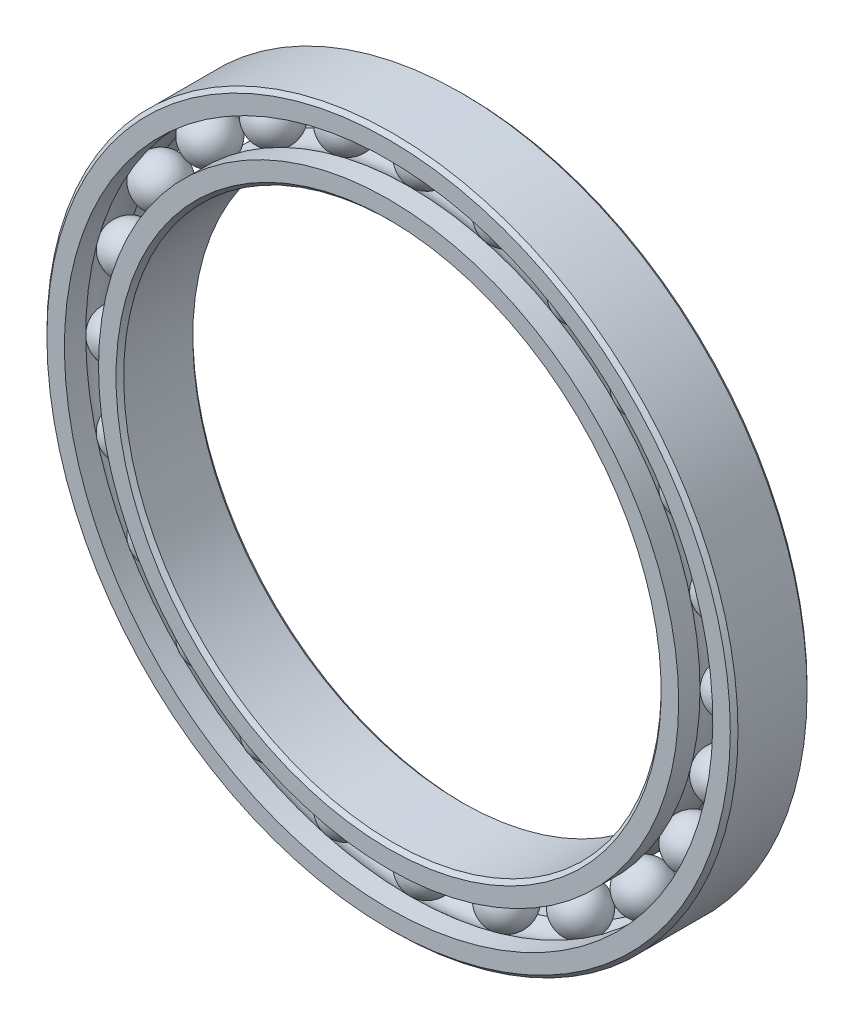
ISO-10303-21;
HEADER;
FILE_DESCRIPTION(('STEP AP214'),'2;1');
FILE_NAME('part.step','',(''),(''),'','','');
FILE_SCHEMA(('AUTOMOTIVE_DESIGN { 1 0 10303 214 1 1 1 1 }'));
ENDSEC;
DATA;
#1=APPLICATION_CONTEXT('core data for automotive mechanical design processes');
#2=APPLICATION_PROTOCOL_DEFINITION('international standard','automotive_design',2000,#1);
#3=PRODUCT_CONTEXT('',#1,'mechanical');
#4=PRODUCT('Part','Part','',(#3));
#5=PRODUCT_RELATED_PRODUCT_CATEGORY('part','',(#4));
#6=PRODUCT_DEFINITION_FORMATION('','',#4);
#7=PRODUCT_DEFINITION_CONTEXT('part definition',#1,'design');
#8=PRODUCT_DEFINITION('design','',#6,#7);
#9=PRODUCT_DEFINITION_SHAPE('','',#8);
#10=(LENGTH_UNIT() NAMED_UNIT(*) SI_UNIT(.MILLI.,.METRE.));
#11=(NAMED_UNIT(*) PLANE_ANGLE_UNIT() SI_UNIT($,.RADIAN.));
#12=(NAMED_UNIT(*) SI_UNIT($,.STERADIAN.) SOLID_ANGLE_UNIT());
#13=UNCERTAINTY_MEASURE_WITH_UNIT(LENGTH_MEASURE(1.E-05),#10,'distance_accuracy_value','');
#14=(GEOMETRIC_REPRESENTATION_CONTEXT(3) GLOBAL_UNCERTAINTY_ASSIGNED_CONTEXT((#13)) GLOBAL_UNIT_ASSIGNED_CONTEXT((#10,
#11,#12)) REPRESENTATION_CONTEXT('',''));
#15=CARTESIAN_POINT('',(0.,0.,0.));
#16=DIRECTION('',(0.,0.,1.));
#17=DIRECTION('',(1.,0.,0.));
#18=AXIS2_PLACEMENT_3D('',#15,#16,#17);
#19=CARTESIAN_POINT('',(10.3527618041003,38.6370330515629,0.));
#20=DIRECTION('',(0.,0.,1.));
#21=DIRECTION('',(0.258819045102508,0.965925826289072,0.));
#22=AXIS2_PLACEMENT_3D('',#19,#20,#21);
#23=SPHERICAL_SURFACE('',#22,3.14269680527354);
#24=CARTESIAN_POINT('',(10.3527618041003,38.6370330515629,3.14269680527354));
#25=VERTEX_POINT('',#24);
#26=VERTEX_LOOP('',#25);
#27=FACE_BOUND('',#26,.T.);
#28=ADVANCED_FACE('F42',(#27),#23,.T.);
#29=CLOSED_SHELL('',(#28));
#30=MANIFOLD_SOLID_BREP('B2',#29);
#31=CARTESIAN_POINT('',(19.9999999999996,34.6410161513778,0.));
#32=DIRECTION('',(0.,0.,1.));
#33=DIRECTION('',(0.499999999999989,0.866025403784445,0.));
#34=AXIS2_PLACEMENT_3D('',#31,#32,#33);
#35=SPHERICAL_SURFACE('',#34,3.14269680527354);
#36=CARTESIAN_POINT('',(19.9999999999996,34.6410161513778,3.14269680527354));
#37=VERTEX_POINT('',#36);
#38=VERTEX_LOOP('',#37);
#39=FACE_BOUND('',#38,.T.);
#40=ADVANCED_FACE('F59',(#39),#35,.T.);
#41=CLOSED_SHELL('',(#40));
#42=MANIFOLD_SOLID_BREP('B6',#41);
#43=CARTESIAN_POINT('',(28.2842712474616,28.2842712474623,0.));
#44=DIRECTION('',(0.,0.,1.));
#45=DIRECTION('',(0.707106781186539,0.707106781186556,0.));
#46=AXIS2_PLACEMENT_3D('',#43,#44,#45);
#47=SPHERICAL_SURFACE('',#46,3.14269680527354);
#48=CARTESIAN_POINT('',(28.2842712474616,28.2842712474623,3.14269680527354));
#49=VERTEX_POINT('',#48);
#50=VERTEX_LOOP('',#49);
#51=FACE_BOUND('',#50,.T.);
#52=ADVANCED_FACE('F76',(#51),#47,.T.);
#53=CLOSED_SHELL('',(#52));
#54=MANIFOLD_SOLID_BREP('B38',#53);
#55=CARTESIAN_POINT('',(34.6410161513773,20.0000000000004,0.));
#56=DIRECTION('',(0.,0.,1.));
#57=DIRECTION('',(0.866025403784433,0.50000000000001,0.));
#58=AXIS2_PLACEMENT_3D('',#55,#56,#57);
#59=SPHERICAL_SURFACE('',#58,3.14269680527354);
#60=CARTESIAN_POINT('',(34.6410161513773,20.0000000000004,3.14269680527354));
#61=VERTEX_POINT('',#60);
#62=VERTEX_LOOP('',#61);
#63=FACE_BOUND('',#62,.T.);
#64=ADVANCED_FACE('F93',(#63),#59,.T.);
#65=CLOSED_SHELL('',(#64));
#66=MANIFOLD_SOLID_BREP('B55',#65);
#67=CARTESIAN_POINT('',(38.6370330515626,10.3527618041013,0.));
#68=DIRECTION('',(0.,0.,1.));
#69=DIRECTION('',(0.965925826289065,0.258819045102531,0.));
#70=AXIS2_PLACEMENT_3D('',#67,#68,#69);
#71=SPHERICAL_SURFACE('',#70,3.14269680527354);
#72=CARTESIAN_POINT('',(38.6370330515626,10.3527618041013,3.14269680527354));
#73=VERTEX_POINT('',#72);
#74=VERTEX_LOOP('',#73);
#75=FACE_BOUND('',#74,.T.);
#76=ADVANCED_FACE('F110',(#75),#71,.T.);
#77=CLOSED_SHELL('',(#76));
#78=MANIFOLD_SOLID_BREP('B72',#77);
#79=CARTESIAN_POINT('',(40.,4.18977760661176E-13,0.));
#80=DIRECTION('',(0.,0.,1.));
#81=DIRECTION('',(1.,0.,0.));
#82=AXIS2_PLACEMENT_3D('',#79,#80,#81);
#83=SPHERICAL_SURFACE('',#82,3.14269680527354);
#84=CARTESIAN_POINT('',(40.,4.18592891302849E-13,3.14269680527354));
#85=VERTEX_POINT('',#84);
#86=VERTEX_LOOP('',#85);
#87=FACE_BOUND('',#86,.T.);
#88=ADVANCED_FACE('F127',(#87),#83,.T.);
#89=CLOSED_SHELL('',(#88));
#90=MANIFOLD_SOLID_BREP('B89',#89);
#91=CARTESIAN_POINT('',(38.6370330515628,-10.3527618041004,0.));
#92=DIRECTION('',(0.,0.,1.));
#93=DIRECTION('',(0.965925826289071,-0.258819045102511,0.));
#94=AXIS2_PLACEMENT_3D('',#91,#92,#93);
#95=SPHERICAL_SURFACE('',#94,3.14269680527354);
#96=CARTESIAN_POINT('',(38.6370330515628,-10.3527618041004,3.14269680527354));
#97=VERTEX_POINT('',#96);
#98=VERTEX_LOOP('',#97);
#99=FACE_BOUND('',#98,.T.);
#100=ADVANCED_FACE('F144',(#99),#95,.T.);
#101=CLOSED_SHELL('',(#100));
#102=MANIFOLD_SOLID_BREP('B106',#101);
#103=CARTESIAN_POINT('',(34.6410161513777,-19.9999999999997,0.));
#104=DIRECTION('',(0.,0.,1.));
#105=DIRECTION('',(0.866025403784443,-0.499999999999992,0.));
#106=AXIS2_PLACEMENT_3D('',#103,#104,#105);
#107=SPHERICAL_SURFACE('',#106,3.14269680527354);
#108=CARTESIAN_POINT('',(34.6410161513777,-19.9999999999997,3.14269680527353));
#109=VERTEX_POINT('',#108);
#110=VERTEX_LOOP('',#109);
#111=FACE_BOUND('',#110,.T.);
#112=ADVANCED_FACE('F161',(#111),#107,.T.);
#113=CLOSED_SHELL('',(#112));
#114=MANIFOLD_SOLID_BREP('B123',#113);
#115=CARTESIAN_POINT('',(28.2842712474622,-28.2842712474617,0.));
#116=DIRECTION('',(0.,0.,1.));
#117=DIRECTION('',(0.707106781186554,-0.707106781186541,0.));
#118=AXIS2_PLACEMENT_3D('',#115,#116,#117);
#119=SPHERICAL_SURFACE('',#118,3.14269680527354);
#120=CARTESIAN_POINT('',(28.2842712474622,-28.2842712474617,3.14269680527353));
#121=VERTEX_POINT('',#120);
#122=VERTEX_LOOP('',#121);
#123=FACE_BOUND('',#122,.T.);
#124=ADVANCED_FACE('F178',(#123),#119,.T.);
#125=CLOSED_SHELL('',(#124));
#126=MANIFOLD_SOLID_BREP('B140',#125);
#127=CARTESIAN_POINT('',(20.0000000000003,-34.6410161513774,0.));
#128=DIRECTION('',(0.,0.,1.));
#129=DIRECTION('',(0.500000000000007,-0.866025403784435,0.));
#130=AXIS2_PLACEMENT_3D('',#127,#128,#129);
#131=SPHERICAL_SURFACE('',#130,3.14269680527354);
#132=CARTESIAN_POINT('',(20.0000000000003,-34.6410161513774,3.14269680527353));
#133=VERTEX_POINT('',#132);
#134=VERTEX_LOOP('',#133);
#135=FACE_BOUND('',#134,.T.);
#136=ADVANCED_FACE('F195',(#135),#131,.T.);
#137=CLOSED_SHELL('',(#136));
#138=MANIFOLD_SOLID_BREP('B157',#137);
#139=CARTESIAN_POINT('',(10.3527618041011,-38.6370330515627,0.));
#140=DIRECTION('',(0.,0.,1.));
#141=DIRECTION('',(0.258819045102528,-0.965925826289066,0.));
#142=AXIS2_PLACEMENT_3D('',#139,#140,#141);
#143=SPHERICAL_SURFACE('',#142,3.14269680527354);
#144=CARTESIAN_POINT('',(10.3527618041011,-38.6370330515627,3.14269680527353));
#145=VERTEX_POINT('',#144);
#146=VERTEX_LOOP('',#145);
#147=FACE_BOUND('',#146,.T.);
#148=ADVANCED_FACE('F212',(#147),#143,.T.);
#149=CLOSED_SHELL('',(#148));
#150=MANIFOLD_SOLID_BREP('B174',#149);
#151=CARTESIAN_POINT('',(0.,-40.,0.));
#152=DIRECTION('',(0.,0.,1.));
#153=DIRECTION('',(0.,-1.,0.));
#154=AXIS2_PLACEMENT_3D('',#151,#152,#153);
#155=SPHERICAL_SURFACE('',#154,3.14269680527354);
#156=CARTESIAN_POINT('',(0.,-40.,3.14269680527353));
#157=VERTEX_POINT('',#156);
#158=VERTEX_LOOP('',#157);
#159=FACE_BOUND('',#158,.T.);
#160=ADVANCED_FACE('F229',(#159),#155,.T.);
#161=CLOSED_SHELL('',(#160));
#162=MANIFOLD_SOLID_BREP('B191',#161);
#163=CARTESIAN_POINT('',(-10.3527618041006,-38.6370330515628,0.));
#164=DIRECTION('',(0.,0.,1.));
#165=DIRECTION('',(-0.258819045102515,-0.96592582628907,0.));
#166=AXIS2_PLACEMENT_3D('',#163,#164,#165);
#167=SPHERICAL_SURFACE('',#166,3.14269680527354);
#168=CARTESIAN_POINT('',(-10.3527618041006,-38.6370330515628,3.14269680527353));
#169=VERTEX_POINT('',#168);
#170=VERTEX_LOOP('',#169);
#171=FACE_BOUND('',#170,.T.);
#172=ADVANCED_FACE('F246',(#171),#167,.T.);
#173=CLOSED_SHELL('',(#172));
#174=MANIFOLD_SOLID_BREP('B208',#173);
#175=CARTESIAN_POINT('',(-19.9999999999998,-34.6410161513777,0.));
#176=DIRECTION('',(0.,0.,1.));
#177=DIRECTION('',(-0.499999999999995,-0.866025403784442,0.));
#178=AXIS2_PLACEMENT_3D('',#175,#176,#177);
#179=SPHERICAL_SURFACE('',#178,3.14269680527354);
#180=CARTESIAN_POINT('',(-19.9999999999998,-34.6410161513777,3.14269680527353));
#181=VERTEX_POINT('',#180);
#182=VERTEX_LOOP('',#181);
#183=FACE_BOUND('',#182,.T.);
#184=ADVANCED_FACE('F263',(#183),#179,.T.);
#185=CLOSED_SHELL('',(#184));
#186=MANIFOLD_SOLID_BREP('B225',#185);
#187=CARTESIAN_POINT('',(-28.2842712474618,-28.2842712474621,0.));
#188=DIRECTION('',(0.,0.,1.));
#189=DIRECTION('',(-0.707106781186544,-0.707106781186551,0.));
#190=AXIS2_PLACEMENT_3D('',#187,#188,#189);
#191=SPHERICAL_SURFACE('',#190,3.14269680527354);
#192=CARTESIAN_POINT('',(-28.2842712474618,-28.2842712474621,3.14269680527353));
#193=VERTEX_POINT('',#192);
#194=VERTEX_LOOP('',#193);
#195=FACE_BOUND('',#194,.T.);
#196=ADVANCED_FACE('F280',(#195),#191,.T.);
#197=CLOSED_SHELL('',(#196));
#198=MANIFOLD_SOLID_BREP('B242',#197);
#199=CARTESIAN_POINT('',(-34.6410161513775,-20.0000000000002,0.));
#200=DIRECTION('',(0.,0.,1.));
#201=DIRECTION('',(-0.866025403784436,-0.500000000000004,0.));
#202=AXIS2_PLACEMENT_3D('',#199,#200,#201);
#203=SPHERICAL_SURFACE('',#202,3.14269680527354);
#204=CARTESIAN_POINT('',(-34.6410161513775,-20.0000000000002,3.14269680527353));
#205=VERTEX_POINT('',#204);
#206=VERTEX_LOOP('',#205);
#207=FACE_BOUND('',#206,.T.);
#208=ADVANCED_FACE('F297',(#207),#203,.T.);
#209=CLOSED_SHELL('',(#208));
#210=MANIFOLD_SOLID_BREP('B259',#209);
#211=CARTESIAN_POINT('',(-38.6370330515627,-10.352761804101,0.));
#212=DIRECTION('',(0.,0.,1.));
#213=DIRECTION('',(-0.965925826289067,-0.258819045102525,0.));
#214=AXIS2_PLACEMENT_3D('',#211,#212,#213);
#215=SPHERICAL_SURFACE('',#214,3.14269680527354);
#216=CARTESIAN_POINT('',(-38.6370330515627,-10.352761804101,3.14269680527354));
#217=VERTEX_POINT('',#216);
#218=VERTEX_LOOP('',#217);
#219=FACE_BOUND('',#218,.T.);
#220=ADVANCED_FACE('F314',(#219),#215,.T.);
#221=CLOSED_SHELL('',(#220));
#222=MANIFOLD_SOLID_BREP('B276',#221);
#223=CARTESIAN_POINT('',(-40.,-1.39659253553725E-13,0.));
#224=DIRECTION('',(0.,0.,1.));
#225=DIRECTION('',(-1.,0.,0.));
#226=AXIS2_PLACEMENT_3D('',#223,#224,#225);
#227=SPHERICAL_SURFACE('',#226,3.14269680527354);
#228=CARTESIAN_POINT('',(-40.,-1.40044122912052E-13,3.14269680527354));
#229=VERTEX_POINT('',#228);
#230=VERTEX_LOOP('',#229);
#231=FACE_BOUND('',#230,.T.);
#232=ADVANCED_FACE('F331',(#231),#227,.T.);
#233=CLOSED_SHELL('',(#232));
#234=MANIFOLD_SOLID_BREP('B293',#233);
#235=CARTESIAN_POINT('',(-38.6370330515628,10.3527618041007,0.));
#236=DIRECTION('',(0.,0.,1.));
#237=DIRECTION('',(-0.965925826289069,0.258819045102518,0.));
#238=AXIS2_PLACEMENT_3D('',#235,#236,#237);
#239=SPHERICAL_SURFACE('',#238,3.14269680527354);
#240=CARTESIAN_POINT('',(-38.6370330515628,10.3527618041007,3.14269680527354));
#241=VERTEX_POINT('',#240);
#242=VERTEX_LOOP('',#241);
#243=FACE_BOUND('',#242,.T.);
#244=ADVANCED_FACE('F348',(#243),#239,.T.);
#245=CLOSED_SHELL('',(#244));
#246=MANIFOLD_SOLID_BREP('B310',#245);
#247=CARTESIAN_POINT('',(-34.6410161513776,19.9999999999999,0.));
#248=DIRECTION('',(0.,0.,1.));
#249=DIRECTION('',(-0.86602540378444,0.499999999999998,0.));
#250=AXIS2_PLACEMENT_3D('',#247,#248,#249);
#251=SPHERICAL_SURFACE('',#250,3.14269680527354);
#252=CARTESIAN_POINT('',(-34.6410161513776,19.9999999999999,3.14269680527354));
#253=VERTEX_POINT('',#252);
#254=VERTEX_LOOP('',#253);
#255=FACE_BOUND('',#254,.T.);
#256=ADVANCED_FACE('F365',(#255),#251,.T.);
#257=CLOSED_SHELL('',(#256));
#258=MANIFOLD_SOLID_BREP('B327',#257);
#259=CARTESIAN_POINT('',(-28.284271247462,28.2842712474619,0.));
#260=DIRECTION('',(0.,0.,1.));
#261=DIRECTION('',(-0.707106781186549,0.707106781186546,0.));
#262=AXIS2_PLACEMENT_3D('',#259,#260,#261);
#263=SPHERICAL_SURFACE('',#262,3.14269680527354);
#264=CARTESIAN_POINT('',(-28.284271247462,28.2842712474619,3.14269680527354));
#265=VERTEX_POINT('',#264);
#266=VERTEX_LOOP('',#265);
#267=FACE_BOUND('',#266,.T.);
#268=ADVANCED_FACE('F382',(#267),#263,.T.);
#269=CLOSED_SHELL('',(#268));
#270=MANIFOLD_SOLID_BREP('B344',#269);
#271=CARTESIAN_POINT('',(-20.,34.6410161513775,0.));
#272=DIRECTION('',(0.,0.,1.));
#273=DIRECTION('',(-0.500000000000001,0.866025403784438,0.));
#274=AXIS2_PLACEMENT_3D('',#271,#272,#273);
#275=SPHERICAL_SURFACE('',#274,3.14269680527354);
#276=CARTESIAN_POINT('',(-20.,34.6410161513775,3.14269680527354));
#277=VERTEX_POINT('',#276);
#278=VERTEX_LOOP('',#277);
#279=FACE_BOUND('',#278,.T.);
#280=ADVANCED_FACE('F399',(#279),#275,.T.);
#281=CLOSED_SHELL('',(#280));
#282=MANIFOLD_SOLID_BREP('B361',#281);
#283=CARTESIAN_POINT('',(-10.3527618041009,38.6370330515627,0.));
#284=DIRECTION('',(0.,0.,1.));
#285=DIRECTION('',(-0.258819045102521,0.965925826289068,0.));
#286=AXIS2_PLACEMENT_3D('',#283,#284,#285);
#287=SPHERICAL_SURFACE('',#286,3.14269680527354);
#288=CARTESIAN_POINT('',(-10.3527618041009,38.6370330515627,3.14269680527354));
#289=VERTEX_POINT('',#288);
#290=VERTEX_LOOP('',#289);
#291=FACE_BOUND('',#290,.T.);
#292=ADVANCED_FACE('F416',(#291),#287,.T.);
#293=CLOSED_SHELL('',(#292));
#294=MANIFOLD_SOLID_BREP('B378',#293);
#295=CARTESIAN_POINT('',(0.,40.,0.));
#296=DIRECTION('',(0.,0.,1.));
#297=DIRECTION('',(0.,1.,0.));
#298=AXIS2_PLACEMENT_3D('',#295,#296,#297);
#299=SPHERICAL_SURFACE('',#298,3.14269680527354);
#300=CARTESIAN_POINT('',(0.,40.,3.14269680527354));
#301=VERTEX_POINT('',#300);
#302=VERTEX_LOOP('',#301);
#303=FACE_BOUND('',#302,.T.);
#304=ADVANCED_FACE('F435',(#303),#299,.T.);
#305=CLOSED_SHELL('',(#304));
#306=MANIFOLD_SOLID_BREP('B395',#305);
#307=CARTESIAN_POINT('',(0.,37.7777777777778,5.00000000000001));
#308=DIRECTION('',(0.,0.,-1.));
#309=DIRECTION('',(0.,1.,0.));
#310=AXIS2_PLACEMENT_3D('',#307,#308,#309);
#311=PLANE('',#310);
#312=CARTESIAN_POINT('',(0.,0.,5.));
#313=DIRECTION('',(0.,0.,1.));
#314=DIRECTION('',(0.,-1.,0.));
#315=AXIS2_PLACEMENT_3D('',#312,#313,#314);
#316=CIRCLE('',#315,35.5);
#317=CARTESIAN_POINT('',(0.,-35.5,5.));
#318=VERTEX_POINT('',#317);
#319=EDGE_CURVE('E481',#318,#318,#316,.T.);
#320=ORIENTED_EDGE('',*,*,#319,.F.);
#321=EDGE_LOOP('',(#320));
#322=FACE_BOUND('',#321,.T.);
#323=CARTESIAN_POINT('',(0.,0.,5.00000000000001));
#324=DIRECTION('',(0.,0.,1.));
#325=DIRECTION('',(0.,-1.,0.));
#326=AXIS2_PLACEMENT_3D('',#323,#324,#325);
#327=CIRCLE('',#326,37.7777777777778);
#328=CARTESIAN_POINT('',(0.,-37.7777777777778,5.));
#329=VERTEX_POINT('',#328);
#330=EDGE_CURVE('E434',#329,#329,#327,.T.);
#331=ORIENTED_EDGE('',*,*,#330,.T.);
#332=EDGE_LOOP('',(#331));
#333=FACE_BOUND('',#332,.T.);
#334=ADVANCED_FACE('F453',(#322,#333),#311,.F.);
#335=CARTESIAN_POINT('',(0.,0.,4.99999999999999));
#336=DIRECTION('',(0.,0.,1.));
#337=DIRECTION('',(0.,-1.,0.));
#338=AXIS2_PLACEMENT_3D('',#335,#336,#337);
#339=CYLINDRICAL_SURFACE('',#338,37.7777777777778);
#340=ORIENTED_EDGE('',*,*,#330,.F.);
#341=EDGE_LOOP('',(#340));
#342=FACE_BOUND('',#341,.T.);
#343=CARTESIAN_POINT('',(0.,0.,2.22222222222222));
#344=DIRECTION('',(0.,0.,1.));
#345=DIRECTION('',(0.,-1.,0.));
#346=AXIS2_PLACEMENT_3D('',#343,#344,#345);
#347=CIRCLE('',#346,37.7777777777778);
#348=CARTESIAN_POINT('',(0.,-37.7777777777778,2.22222222222221));
#349=VERTEX_POINT('',#348);
#350=EDGE_CURVE('E459',#349,#349,#347,.T.);
#351=ORIENTED_EDGE('',*,*,#350,.T.);
#352=EDGE_LOOP('',(#351));
#353=FACE_BOUND('',#352,.T.);
#354=ADVANCED_FACE('F488',(#342,#353),#339,.T.);
#355=CARTESIAN_POINT('',(0.,0.,0.));
#356=DIRECTION('',(0.,0.,1.));
#357=DIRECTION('',(0.,-1.,0.));
#358=AXIS2_PLACEMENT_3D('',#355,#356,#357);
#359=TOROIDAL_SURFACE('',#358,40.,3.14269680527354);
#360=ORIENTED_EDGE('',*,*,#350,.F.);
#361=EDGE_LOOP('',(#360));
#362=FACE_BOUND('',#361,.T.);
#363=CARTESIAN_POINT('',(0.,0.,-2.22222222222223));
#364=DIRECTION('',(0.,0.,1.));
#365=DIRECTION('',(0.,-1.,0.));
#366=AXIS2_PLACEMENT_3D('',#363,#364,#365);
#367=CIRCLE('',#366,37.7777777777778);
#368=CARTESIAN_POINT('',(0.,-37.7777777777778,-2.22222222222223));
#369=VERTEX_POINT('',#368);
#370=EDGE_CURVE('E463',#369,#369,#367,.T.);
#371=ORIENTED_EDGE('',*,*,#370,.T.);
#372=EDGE_LOOP('',(#371));
#373=FACE_BOUND('',#372,.T.);
#374=ADVANCED_FACE('F492',(#362,#373),#359,.F.);
#375=CARTESIAN_POINT('',(0.,0.,4.99999999999999));
#376=DIRECTION('',(0.,0.,1.));
#377=DIRECTION('',(0.,-1.,0.));
#378=AXIS2_PLACEMENT_3D('',#375,#376,#377);
#379=CYLINDRICAL_SURFACE('',#378,37.7777777777778);
#380=ORIENTED_EDGE('',*,*,#370,.F.);
#381=EDGE_LOOP('',(#380));
#382=FACE_BOUND('',#381,.T.);
#383=CARTESIAN_POINT('',(0.,0.,-5.00000000000002));
#384=DIRECTION('',(0.,0.,1.));
#385=DIRECTION('',(0.,-1.,0.));
#386=AXIS2_PLACEMENT_3D('',#383,#384,#385);
#387=CIRCLE('',#386,37.7777777777778);
#388=CARTESIAN_POINT('',(0.,-37.7777777777778,-5.00000000000002));
#389=VERTEX_POINT('',#388);
#390=EDGE_CURVE('E467',#389,#389,#387,.T.);
#391=ORIENTED_EDGE('',*,*,#390,.T.);
#392=EDGE_LOOP('',(#391));
#393=FACE_BOUND('',#392,.T.);
#394=ADVANCED_FACE('F497',(#382,#393),#379,.T.);
#395=CARTESIAN_POINT('',(0.,35.5,-5.00000000000001));
#396=DIRECTION('',(0.,0.,1.));
#397=DIRECTION('',(0.,-1.,0.));
#398=AXIS2_PLACEMENT_3D('',#395,#396,#397);
#399=PLANE('',#398);
#400=ORIENTED_EDGE('',*,*,#390,.F.);
#401=EDGE_LOOP('',(#400));
#402=FACE_BOUND('',#401,.T.);
#403=CARTESIAN_POINT('',(0.,0.,-5.00000000000002));
#404=DIRECTION('',(0.,0.,1.));
#405=DIRECTION('',(0.,-1.,0.));
#406=AXIS2_PLACEMENT_3D('',#403,#404,#405);
#407=CIRCLE('',#406,35.5);
#408=CARTESIAN_POINT('',(0.,-35.5,-5.00000000000002));
#409=VERTEX_POINT('',#408);
#410=EDGE_CURVE('E472',#409,#409,#407,.T.);
#411=ORIENTED_EDGE('',*,*,#410,.T.);
#412=EDGE_LOOP('',(#411));
#413=FACE_BOUND('',#412,.T.);
#414=ADVANCED_FACE('F503',(#402,#413),#399,.F.);
#415=CARTESIAN_POINT('',(0.,0.,-4.50000000000001));
#416=DIRECTION('',(0.,0.,-1.));
#417=DIRECTION('',(0.,1.,0.));
#418=AXIS2_PLACEMENT_3D('',#415,#416,#417);
#419=CONICAL_SURFACE('',#418,35.,0.785398163397426);
#420=ORIENTED_EDGE('',*,*,#410,.F.);
#421=EDGE_LOOP('',(#420));
#422=FACE_BOUND('',#421,.T.);
#423=CARTESIAN_POINT('',(0.,0.,-4.50000000000001));
#424=DIRECTION('',(0.,0.,1.));
#425=DIRECTION('',(0.,-1.,0.));
#426=AXIS2_PLACEMENT_3D('',#423,#424,#425);
#427=CIRCLE('',#426,35.);
#428=CARTESIAN_POINT('',(0.,-35.,-4.50000000000001));
#429=VERTEX_POINT('',#428);
#430=EDGE_CURVE('E475',#429,#429,#427,.T.);
#431=ORIENTED_EDGE('',*,*,#430,.T.);
#432=EDGE_LOOP('',(#431));
#433=FACE_BOUND('',#432,.T.);
#434=ADVANCED_FACE('F507',(#422,#433),#419,.F.);
#435=CARTESIAN_POINT('',(0.,0.,4.99999999999999));
#436=DIRECTION('',(0.,0.,1.));
#437=DIRECTION('',(0.,-1.,0.));
#438=AXIS2_PLACEMENT_3D('',#435,#436,#437);
#439=CYLINDRICAL_SURFACE('',#438,35.);
#440=ORIENTED_EDGE('',*,*,#430,.F.);
#441=EDGE_LOOP('',(#440));
#442=FACE_BOUND('',#441,.T.);
#443=CARTESIAN_POINT('',(0.,0.,4.50000000000002));
#444=DIRECTION('',(0.,0.,1.));
#445=DIRECTION('',(0.,-1.,0.));
#446=AXIS2_PLACEMENT_3D('',#443,#444,#445);
#447=CIRCLE('',#446,35.);
#448=CARTESIAN_POINT('',(0.,-35.,4.50000000000001));
#449=VERTEX_POINT('',#448);
#450=EDGE_CURVE('E478',#449,#449,#447,.T.);
#451=ORIENTED_EDGE('',*,*,#450,.T.);
#452=EDGE_LOOP('',(#451));
#453=FACE_BOUND('',#452,.T.);
#454=ADVANCED_FACE('F511',(#442,#453),#439,.F.);
#455=CARTESIAN_POINT('',(0.,0.,5.));
#456=DIRECTION('',(0.,0.,1.));
#457=DIRECTION('',(0.,-1.,0.));
#458=AXIS2_PLACEMENT_3D('',#455,#456,#457);
#459=CONICAL_SURFACE('',#458,35.5,0.78539816339747);
#460=ORIENTED_EDGE('',*,*,#450,.F.);
#461=EDGE_LOOP('',(#460));
#462=FACE_BOUND('',#461,.T.);
#463=ORIENTED_EDGE('',*,*,#319,.T.);
#464=EDGE_LOOP('',(#463));
#465=FACE_BOUND('',#464,.T.);
#466=ADVANCED_FACE('F485',(#462,#465),#459,.F.);
#467=CLOSED_SHELL('',(#334,#354,#374,#394,#414,#434,#454,#466));
#468=MANIFOLD_SOLID_BREP('B412',#467);
#469=CARTESIAN_POINT('',(0.,0.,4.99999999999999));
#470=DIRECTION('',(0.,0.,1.));
#471=DIRECTION('',(0.,-1.,0.));
#472=AXIS2_PLACEMENT_3D('',#469,#470,#471);
#473=CYLINDRICAL_SURFACE('',#472,45.);
#474=CARTESIAN_POINT('',(0.,0.,4.5));
#475=DIRECTION('',(0.,0.,1.));
#476=DIRECTION('',(0.,-1.,0.));
#477=AXIS2_PLACEMENT_3D('',#474,#475,#476);
#478=CIRCLE('',#477,45.);
#479=CARTESIAN_POINT('',(0.,-45.,4.49999999999999));
#480=VERTEX_POINT('',#479);
#481=EDGE_CURVE('E452',#480,#480,#478,.T.);
#482=ORIENTED_EDGE('',*,*,#481,.F.);
#483=EDGE_LOOP('',(#482));
#484=FACE_BOUND('',#483,.T.);
#485=CARTESIAN_POINT('',(0.,0.,-4.50000000000001));
#486=DIRECTION('',(0.,0.,1.));
#487=DIRECTION('',(0.,-1.,0.));
#488=AXIS2_PLACEMENT_3D('',#485,#486,#487);
#489=CIRCLE('',#488,45.);
#490=CARTESIAN_POINT('',(0.,-45.,-4.50000000000001));
#491=VERTEX_POINT('',#490);
#492=EDGE_CURVE('E587',#491,#491,#489,.T.);
#493=ORIENTED_EDGE('',*,*,#492,.T.);
#494=EDGE_LOOP('',(#493));
#495=FACE_BOUND('',#494,.T.);
#496=ADVANCED_FACE('F559',(#484,#495),#473,.T.);
#497=CARTESIAN_POINT('',(0.,0.,4.5));
#498=DIRECTION('',(0.,0.,-1.));
#499=DIRECTION('',(0.,1.,0.));
#500=AXIS2_PLACEMENT_3D('',#497,#498,#499);
#501=CONICAL_SURFACE('',#500,45.,0.785398163397444);
#502=CARTESIAN_POINT('',(0.,0.,4.99999999999999));
#503=DIRECTION('',(0.,0.,1.));
#504=DIRECTION('',(0.,-1.,0.));
#505=AXIS2_PLACEMENT_3D('',#502,#503,#504);
#506=CIRCLE('',#505,44.5);
#507=CARTESIAN_POINT('',(0.,-44.5,4.99999999999999));
#508=VERTEX_POINT('',#507);
#509=EDGE_CURVE('E565',#508,#508,#506,.T.);
#510=ORIENTED_EDGE('',*,*,#509,.F.);
#511=EDGE_LOOP('',(#510));
#512=FACE_BOUND('',#511,.T.);
#513=ORIENTED_EDGE('',*,*,#481,.T.);
#514=EDGE_LOOP('',(#513));
#515=FACE_BOUND('',#514,.T.);
#516=ADVANCED_FACE('F624',(#512,#515),#501,.T.);
#517=CARTESIAN_POINT('',(0.,44.5,5.));
#518=DIRECTION('',(0.,0.,-1.));
#519=DIRECTION('',(0.,1.,0.));
#520=AXIS2_PLACEMENT_3D('',#517,#518,#519);
#521=PLANE('',#520);
#522=CARTESIAN_POINT('',(0.,0.,4.99999999999999));
#523=DIRECTION('',(0.,0.,1.));
#524=DIRECTION('',(0.,-1.,0.));
#525=AXIS2_PLACEMENT_3D('',#522,#523,#524);
#526=CIRCLE('',#525,42.2222222222222);
#527=CARTESIAN_POINT('',(0.,-42.2222222222222,4.99999999999998));
#528=VERTEX_POINT('',#527);
#529=EDGE_CURVE('E569',#528,#528,#526,.T.);
#530=ORIENTED_EDGE('',*,*,#529,.F.);
#531=EDGE_LOOP('',(#530));
#532=FACE_BOUND('',#531,.T.);
#533=ORIENTED_EDGE('',*,*,#509,.T.);
#534=EDGE_LOOP('',(#533));
#535=FACE_BOUND('',#534,.T.);
#536=ADVANCED_FACE('F619',(#532,#535),#521,.F.);
#537=CARTESIAN_POINT('',(0.,0.,4.99999999999999));
#538=DIRECTION('',(0.,0.,1.));
#539=DIRECTION('',(0.,-1.,0.));
#540=AXIS2_PLACEMENT_3D('',#537,#538,#539);
#541=CYLINDRICAL_SURFACE('',#540,42.2222222222222);
#542=CARTESIAN_POINT('',(0.,0.,2.22222222222221));
#543=DIRECTION('',(0.,0.,1.));
#544=DIRECTION('',(0.,-1.,0.));
#545=AXIS2_PLACEMENT_3D('',#542,#543,#544);
#546=CIRCLE('',#545,42.2222222222222);
#547=CARTESIAN_POINT('',(0.,-42.2222222222222,2.22222222222221));
#548=VERTEX_POINT('',#547);
#549=EDGE_CURVE('E573',#548,#548,#546,.T.);
#550=ORIENTED_EDGE('',*,*,#549,.F.);
#551=EDGE_LOOP('',(#550));
#552=FACE_BOUND('',#551,.T.);
#553=ORIENTED_EDGE('',*,*,#529,.T.);
#554=EDGE_LOOP('',(#553));
#555=FACE_BOUND('',#554,.T.);
#556=ADVANCED_FACE('F613',(#552,#555),#541,.F.);
#557=CARTESIAN_POINT('',(0.,0.,0.));
#558=DIRECTION('',(0.,0.,1.));
#559=DIRECTION('',(0.,-1.,0.));
#560=AXIS2_PLACEMENT_3D('',#557,#558,#559);
#561=TOROIDAL_SURFACE('',#560,40.,3.14269680527354);
#562=CARTESIAN_POINT('',(0.,0.,-2.22222222222223));
#563=DIRECTION('',(0.,0.,1.));
#564=DIRECTION('',(0.,-1.,0.));
#565=AXIS2_PLACEMENT_3D('',#562,#563,#564);
#566=CIRCLE('',#565,42.2222222222222);
#567=CARTESIAN_POINT('',(0.,-42.2222222222222,-2.22222222222223));
#568=VERTEX_POINT('',#567);
#569=EDGE_CURVE('E578',#568,#568,#566,.T.);
#570=ORIENTED_EDGE('',*,*,#569,.F.);
#571=EDGE_LOOP('',(#570));
#572=FACE_BOUND('',#571,.T.);
#573=ORIENTED_EDGE('',*,*,#549,.T.);
#574=EDGE_LOOP('',(#573));
#575=FACE_BOUND('',#574,.T.);
#576=ADVANCED_FACE('F607',(#572,#575),#561,.F.);
#577=CARTESIAN_POINT('',(0.,0.,4.99999999999999));
#578=DIRECTION('',(0.,0.,1.));
#579=DIRECTION('',(0.,-1.,0.));
#580=AXIS2_PLACEMENT_3D('',#577,#578,#579);
#581=CYLINDRICAL_SURFACE('',#580,42.2222222222222);
#582=CARTESIAN_POINT('',(0.,0.,-5.));
#583=DIRECTION('',(0.,0.,1.));
#584=DIRECTION('',(0.,-1.,0.));
#585=AXIS2_PLACEMENT_3D('',#582,#583,#584);
#586=CIRCLE('',#585,42.2222222222222);
#587=CARTESIAN_POINT('',(0.,-42.2222222222222,-5.00000000000001));
#588=VERTEX_POINT('',#587);
#589=EDGE_CURVE('E581',#588,#588,#586,.T.);
#590=ORIENTED_EDGE('',*,*,#589,.F.);
#591=EDGE_LOOP('',(#590));
#592=FACE_BOUND('',#591,.T.);
#593=ORIENTED_EDGE('',*,*,#569,.T.);
#594=EDGE_LOOP('',(#593));
#595=FACE_BOUND('',#594,.T.);
#596=ADVANCED_FACE('F601',(#592,#595),#581,.F.);
#597=CARTESIAN_POINT('',(0.,44.5,-5.));
#598=DIRECTION('',(0.,0.,1.));
#599=DIRECTION('',(0.,-1.,0.));
#600=AXIS2_PLACEMENT_3D('',#597,#598,#599);
#601=PLANE('',#600);
#602=CARTESIAN_POINT('',(0.,0.,-5.00000000000001));
#603=DIRECTION('',(0.,0.,1.));
#604=DIRECTION('',(0.,-1.,0.));
#605=AXIS2_PLACEMENT_3D('',#602,#603,#604);
#606=CIRCLE('',#605,44.5);
#607=CARTESIAN_POINT('',(0.,-44.5,-5.00000000000001));
#608=VERTEX_POINT('',#607);
#609=EDGE_CURVE('E584',#608,#608,#606,.T.);
#610=ORIENTED_EDGE('',*,*,#609,.F.);
#611=EDGE_LOOP('',(#610));
#612=FACE_BOUND('',#611,.T.);
#613=ORIENTED_EDGE('',*,*,#589,.T.);
#614=EDGE_LOOP('',(#613));
#615=FACE_BOUND('',#614,.T.);
#616=ADVANCED_FACE('F595',(#612,#615),#601,.F.);
#617=CARTESIAN_POINT('',(0.,0.,-5.00000000000001));
#618=DIRECTION('',(0.,0.,1.));
#619=DIRECTION('',(0.,-1.,0.));
#620=AXIS2_PLACEMENT_3D('',#617,#618,#619);
#621=CONICAL_SURFACE('',#620,44.5,0.785398163397445);
#622=ORIENTED_EDGE('',*,*,#492,.F.);
#623=EDGE_LOOP('',(#622));
#624=FACE_BOUND('',#623,.T.);
#625=ORIENTED_EDGE('',*,*,#609,.T.);
#626=EDGE_LOOP('',(#625));
#627=FACE_BOUND('',#626,.T.);
#628=ADVANCED_FACE('F592',(#624,#627),#621,.T.);
#629=CLOSED_SHELL('',(#496,#516,#536,#556,#576,#596,#616,#628));
#630=MANIFOLD_SOLID_BREP('B429',#629);
#631=ADVANCED_BREP_SHAPE_REPRESENTATION('',(#18,#30,#42,#54,#66,#78,#90,#102,#114,#126,#138,
#150,#162,#174,#186,#198,#210,#222,#234,#246,#258,#270,#282,#294,#306,#468,#630),#14);
#632=SHAPE_DEFINITION_REPRESENTATION(#9,#631);
ENDSEC;
END-ISO-10303-21;
